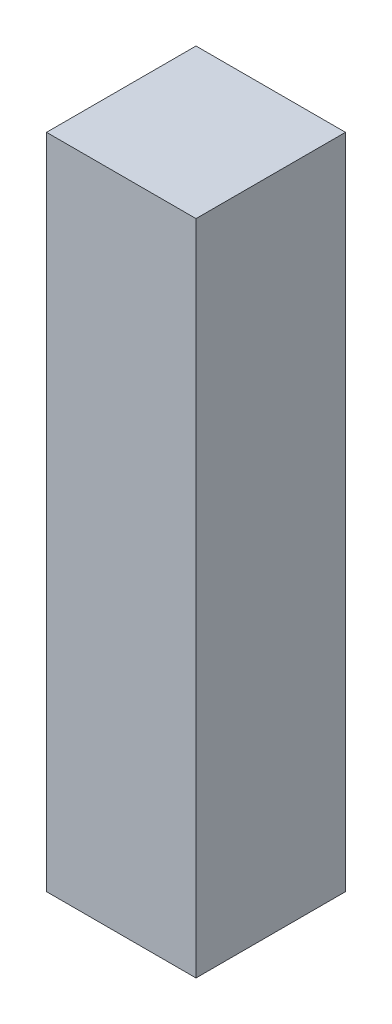
ISO-10303-21;
HEADER;
FILE_DESCRIPTION(('STEP AP214'),'2;1');
FILE_NAME('part.step','',(''),(''),'','','');
FILE_SCHEMA(('AUTOMOTIVE_DESIGN { 1 0 10303 214 1 1 1 1 }'));
ENDSEC;
DATA;
#1=APPLICATION_CONTEXT('core data for automotive mechanical design processes');
#2=APPLICATION_PROTOCOL_DEFINITION('international standard','automotive_design',2000,#1);
#3=PRODUCT_CONTEXT('',#1,'mechanical');
#4=PRODUCT('Part','Part','',(#3));
#5=PRODUCT_RELATED_PRODUCT_CATEGORY('part','',(#4));
#6=PRODUCT_DEFINITION_FORMATION('','',#4);
#7=PRODUCT_DEFINITION_CONTEXT('part definition',#1,'design');
#8=PRODUCT_DEFINITION('design','',#6,#7);
#9=PRODUCT_DEFINITION_SHAPE('','',#8);
#10=(LENGTH_UNIT() NAMED_UNIT(*) SI_UNIT(.MILLI.,.METRE.));
#11=(NAMED_UNIT(*) PLANE_ANGLE_UNIT() SI_UNIT($,.RADIAN.));
#12=(NAMED_UNIT(*) SI_UNIT($,.STERADIAN.) SOLID_ANGLE_UNIT());
#13=UNCERTAINTY_MEASURE_WITH_UNIT(LENGTH_MEASURE(1.E-05),#10,'distance_accuracy_value','');
#14=(GEOMETRIC_REPRESENTATION_CONTEXT(3) GLOBAL_UNCERTAINTY_ASSIGNED_CONTEXT((#13)) GLOBAL_UNIT_ASSIGNED_CONTEXT((#10,
#11,#12)) REPRESENTATION_CONTEXT('',''));
#15=CARTESIAN_POINT('',(0.,0.,0.));
#16=DIRECTION('',(0.,0.,1.));
#17=DIRECTION('',(1.,0.,0.));
#18=AXIS2_PLACEMENT_3D('',#15,#16,#17);
#19=CARTESIAN_POINT('',(-100.,880.,-100.));
#20=DIRECTION('',(1.,0.,0.));
#21=DIRECTION('',(0.,0.,-1.));
#22=AXIS2_PLACEMENT_3D('',#19,#20,#21);
#23=PLANE('',#22);
#24=DIRECTION('',(0.,0.,1.));
#25=VECTOR('',#24,1.);
#26=CARTESIAN_POINT('',(-100.,0.,-100.));
#27=LINE('',#26,#25);
#28=CARTESIAN_POINT('',(-100.,0.,-100.));
#29=VERTEX_POINT('',#28);
#30=CARTESIAN_POINT('',(-100.,0.,100.));
#31=VERTEX_POINT('',#30);
#32=EDGE_CURVE('E104',#29,#31,#27,.T.);
#33=ORIENTED_EDGE('',*,*,#32,.T.);
#34=DIRECTION('',(0.,-1.,0.));
#35=VECTOR('',#34,1.);
#36=CARTESIAN_POINT('',(-100.,880.,100.));
#37=LINE('',#36,#35);
#38=CARTESIAN_POINT('',(-100.,880.,100.));
#39=VERTEX_POINT('',#38);
#40=EDGE_CURVE('E11',#39,#31,#37,.T.);
#41=ORIENTED_EDGE('',*,*,#40,.F.);
#42=DIRECTION('',(0.,0.,1.));
#43=VECTOR('',#42,1.);
#44=CARTESIAN_POINT('',(-100.,880.,-100.));
#45=LINE('',#44,#43);
#46=CARTESIAN_POINT('',(-100.,880.,-100.));
#47=VERTEX_POINT('',#46);
#48=EDGE_CURVE('E92',#47,#39,#45,.T.);
#49=ORIENTED_EDGE('',*,*,#48,.F.);
#50=DIRECTION('',(0.,-1.,0.));
#51=VECTOR('',#50,1.);
#52=CARTESIAN_POINT('',(-100.,880.,-100.));
#53=LINE('',#52,#51);
#54=EDGE_CURVE('E100',#47,#29,#53,.T.);
#55=ORIENTED_EDGE('',*,*,#54,.T.);
#56=EDGE_LOOP('',(#33,#41,#49,#55));
#57=FACE_BOUND('',#56,.T.);
#58=ADVANCED_FACE('F41',(#57),#23,.F.);
#59=CARTESIAN_POINT('',(100.,880.,100.));
#60=DIRECTION('',(0.,0.,-1.));
#61=DIRECTION('',(-1.,0.,0.));
#62=AXIS2_PLACEMENT_3D('',#59,#60,#61);
#63=PLANE('',#62);
#64=DIRECTION('',(1.,0.,0.));
#65=VECTOR('',#64,1.);
#66=CARTESIAN_POINT('',(100.,0.,100.));
#67=LINE('',#66,#65);
#68=CARTESIAN_POINT('',(100.,0.,100.));
#69=VERTEX_POINT('',#68);
#70=EDGE_CURVE('E96',#31,#69,#67,.T.);
#71=ORIENTED_EDGE('',*,*,#70,.T.);
#72=DIRECTION('',(0.,-1.,0.));
#73=VECTOR('',#72,1.);
#74=CARTESIAN_POINT('',(100.,880.,100.));
#75=LINE('',#74,#73);
#76=CARTESIAN_POINT('',(100.,880.,100.));
#77=VERTEX_POINT('',#76);
#78=EDGE_CURVE('E49',#77,#69,#75,.T.);
#79=ORIENTED_EDGE('',*,*,#78,.F.);
#80=DIRECTION('',(1.,0.,0.));
#81=VECTOR('',#80,1.);
#82=CARTESIAN_POINT('',(100.,880.,100.));
#83=LINE('',#82,#81);
#84=EDGE_CURVE('E87',#39,#77,#83,.T.);
#85=ORIENTED_EDGE('',*,*,#84,.F.);
#86=ORIENTED_EDGE('',*,*,#40,.T.);
#87=EDGE_LOOP('',(#71,#79,#85,#86));
#88=FACE_BOUND('',#87,.T.);
#89=ADVANCED_FACE('F95',(#88),#63,.F.);
#90=CARTESIAN_POINT('',(100.,880.,-100.));
#91=DIRECTION('',(-1.,0.,0.));
#92=DIRECTION('',(0.,0.,1.));
#93=AXIS2_PLACEMENT_3D('',#90,#91,#92);
#94=PLANE('',#93);
#95=DIRECTION('',(0.,0.,-1.));
#96=VECTOR('',#95,1.);
#97=CARTESIAN_POINT('',(100.,0.,-100.));
#98=LINE('',#97,#96);
#99=CARTESIAN_POINT('',(100.,0.,-100.));
#100=VERTEX_POINT('',#99);
#101=EDGE_CURVE('E74',#69,#100,#98,.T.);
#102=ORIENTED_EDGE('',*,*,#101,.T.);
#103=DIRECTION('',(0.,-1.,0.));
#104=VECTOR('',#103,1.);
#105=CARTESIAN_POINT('',(100.,880.,-100.));
#106=LINE('',#105,#104);
#107=CARTESIAN_POINT('',(100.,880.,-100.));
#108=VERTEX_POINT('',#107);
#109=EDGE_CURVE('E97',#108,#100,#106,.T.);
#110=ORIENTED_EDGE('',*,*,#109,.F.);
#111=DIRECTION('',(0.,0.,-1.));
#112=VECTOR('',#111,1.);
#113=CARTESIAN_POINT('',(100.,880.,-100.));
#114=LINE('',#113,#112);
#115=EDGE_CURVE('E90',#77,#108,#114,.T.);
#116=ORIENTED_EDGE('',*,*,#115,.F.);
#117=ORIENTED_EDGE('',*,*,#78,.T.);
#118=EDGE_LOOP('',(#102,#110,#116,#117));
#119=FACE_BOUND('',#118,.T.);
#120=ADVANCED_FACE('F98',(#119),#94,.F.);
#121=CARTESIAN_POINT('',(100.,880.,-100.));
#122=DIRECTION('',(0.,0.,1.));
#123=DIRECTION('',(1.,0.,0.));
#124=AXIS2_PLACEMENT_3D('',#121,#122,#123);
#125=PLANE('',#124);
#126=DIRECTION('',(-1.,0.,0.));
#127=VECTOR('',#126,1.);
#128=CARTESIAN_POINT('',(100.,0.,-100.));
#129=LINE('',#128,#127);
#130=EDGE_CURVE('E80',#100,#29,#129,.T.);
#131=ORIENTED_EDGE('',*,*,#130,.T.);
#132=ORIENTED_EDGE('',*,*,#54,.F.);
#133=DIRECTION('',(-1.,0.,0.));
#134=VECTOR('',#133,1.);
#135=CARTESIAN_POINT('',(100.,880.,-100.));
#136=LINE('',#135,#134);
#137=EDGE_CURVE('E57',#108,#47,#136,.T.);
#138=ORIENTED_EDGE('',*,*,#137,.F.);
#139=ORIENTED_EDGE('',*,*,#109,.T.);
#140=EDGE_LOOP('',(#131,#132,#138,#139));
#141=FACE_BOUND('',#140,.T.);
#142=ADVANCED_FACE('F111',(#141),#125,.F.);
#143=CARTESIAN_POINT('',(0.,880.,0.));
#144=DIRECTION('',(0.,-1.,0.));
#145=DIRECTION('',(0.,0.,-1.));
#146=AXIS2_PLACEMENT_3D('',#143,#144,#145);
#147=PLANE('',#146);
#148=ORIENTED_EDGE('',*,*,#48,.T.);
#149=ORIENTED_EDGE('',*,*,#84,.T.);
#150=ORIENTED_EDGE('',*,*,#115,.T.);
#151=ORIENTED_EDGE('',*,*,#137,.T.);
#152=EDGE_LOOP('',(#148,#149,#150,#151));
#153=FACE_BOUND('',#152,.T.);
#154=ADVANCED_FACE('F88',(#153),#147,.F.);
#155=CARTESIAN_POINT('',(0.,0.,0.));
#156=DIRECTION('',(0.,-1.,0.));
#157=DIRECTION('',(0.,0.,-1.));
#158=AXIS2_PLACEMENT_3D('',#155,#156,#157);
#159=PLANE('',#158);
#160=ORIENTED_EDGE('',*,*,#32,.F.);
#161=ORIENTED_EDGE('',*,*,#130,.F.);
#162=ORIENTED_EDGE('',*,*,#101,.F.);
#163=ORIENTED_EDGE('',*,*,#70,.F.);
#164=EDGE_LOOP('',(#160,#161,#162,#163));
#165=FACE_BOUND('',#164,.T.);
#166=ADVANCED_FACE('F114',(#165),#159,.T.);
#167=CLOSED_SHELL('',(#58,#89,#120,#142,#154,#166));
#168=MANIFOLD_SOLID_BREP('B2',#167);
#169=ADVANCED_BREP_SHAPE_REPRESENTATION('',(#18,#168),#14);
#170=SHAPE_DEFINITION_REPRESENTATION(#9,#169);
ENDSEC;
END-ISO-10303-21;
